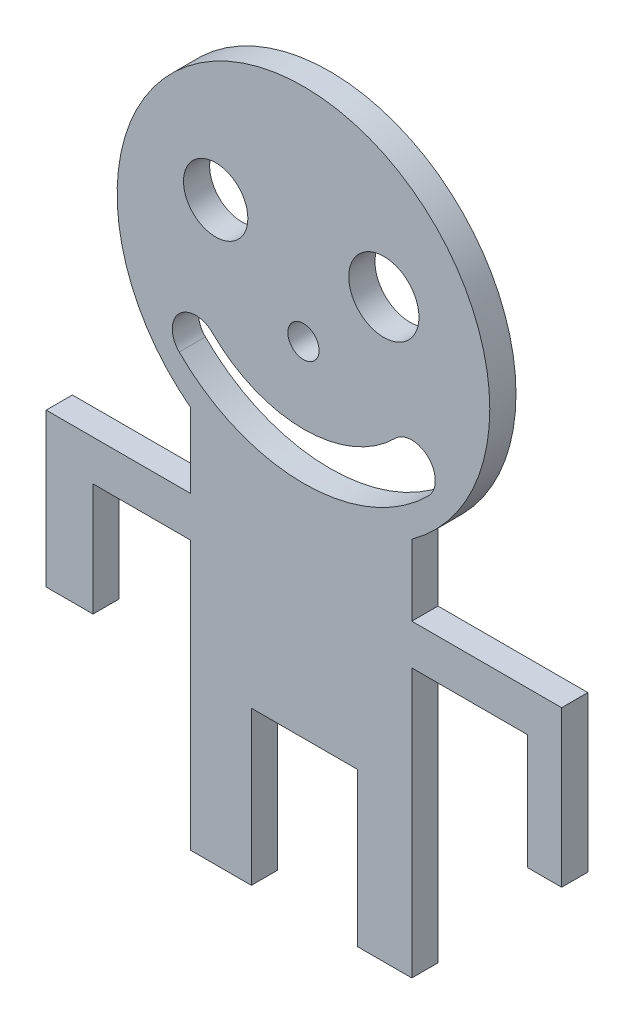
ISO-10303-21;
HEADER;
FILE_DESCRIPTION(('STEP AP214'),'2;1');
FILE_NAME('part.step','',(''),(''),'','','');
FILE_SCHEMA(('AUTOMOTIVE_DESIGN { 1 0 10303 214 1 1 1 1 }'));
ENDSEC;
DATA;
#1=APPLICATION_CONTEXT('core data for automotive mechanical design processes');
#2=APPLICATION_PROTOCOL_DEFINITION('international standard','automotive_design',2000,#1);
#3=PRODUCT_CONTEXT('',#1,'mechanical');
#4=PRODUCT('Part','Part','',(#3));
#5=PRODUCT_RELATED_PRODUCT_CATEGORY('part','',(#4));
#6=PRODUCT_DEFINITION_FORMATION('','',#4);
#7=PRODUCT_DEFINITION_CONTEXT('part definition',#1,'design');
#8=PRODUCT_DEFINITION('design','',#6,#7);
#9=PRODUCT_DEFINITION_SHAPE('','',#8);
#10=(LENGTH_UNIT() NAMED_UNIT(*) SI_UNIT(.MILLI.,.METRE.));
#11=(NAMED_UNIT(*) PLANE_ANGLE_UNIT() SI_UNIT($,.RADIAN.));
#12=(NAMED_UNIT(*) SI_UNIT($,.STERADIAN.) SOLID_ANGLE_UNIT());
#13=UNCERTAINTY_MEASURE_WITH_UNIT(LENGTH_MEASURE(1.E-05),#10,'distance_accuracy_value','');
#14=(GEOMETRIC_REPRESENTATION_CONTEXT(3) GLOBAL_UNCERTAINTY_ASSIGNED_CONTEXT((#13)) GLOBAL_UNIT_ASSIGNED_CONTEXT((#10,
#11,#12)) REPRESENTATION_CONTEXT('',''));
#15=CARTESIAN_POINT('',(0.,0.,0.));
#16=DIRECTION('',(0.,0.,1.));
#17=DIRECTION('',(1.,0.,0.));
#18=AXIS2_PLACEMENT_3D('',#15,#16,#17);
#19=CARTESIAN_POINT('',(0.,0.,10.));
#20=DIRECTION('',(0.,0.,1.));
#21=DIRECTION('',(1.,0.,0.));
#22=AXIS2_PLACEMENT_3D('',#19,#20,#21);
#23=PLANE('',#22);
#24=CARTESIAN_POINT('',(30.6884901447946,16.8513640326862,10.));
#25=DIRECTION('',(0.,0.,1.));
#26=DIRECTION('',(1.,0.,0.));
#27=AXIS2_PLACEMENT_3D('',#24,#25,#26);
#28=CIRCLE('',#27,13.4023424425975);
#29=CARTESIAN_POINT('',(44.0908325873921,16.8513640326862,10.));
#30=VERTEX_POINT('',#29);
#31=EDGE_CURVE('E257',#30,#30,#28,.T.);
#32=ORIENTED_EDGE('',*,*,#31,.F.);
#33=EDGE_LOOP('',(#32));
#34=FACE_BOUND('',#33,.T.);
#35=CARTESIAN_POINT('',(0.,0.,10.));
#36=DIRECTION('',(0.,0.,1.));
#37=DIRECTION('',(1.,0.,0.));
#38=AXIS2_PLACEMENT_3D('',#35,#36,#37);
#39=CIRCLE('',#38,71.1280028052425);
#40=CARTESIAN_POINT('',(41.3499882728577,-57.8737527113727,10.));
#41=VERTEX_POINT('',#40);
#42=CARTESIAN_POINT('',(-43.1667082599356,-56.5316555662771,10.));
#43=VERTEX_POINT('',#42);
#44=EDGE_CURVE('E273',#41,#43,#39,.T.);
#45=ORIENTED_EDGE('',*,*,#44,.T.);
#46=DIRECTION('',(0.,-1.,0.));
#47=VECTOR('',#46,1.);
#48=CARTESIAN_POINT('',(-43.1667082599356,-56.5316555662771,10.));
#49=LINE('',#48,#47);
#50=CARTESIAN_POINT('',(-43.1667082599356,-85.0113060817988,10.));
#51=VERTEX_POINT('',#50);
#52=EDGE_CURVE('E277',#43,#51,#49,.T.);
#53=ORIENTED_EDGE('',*,*,#52,.T.);
#54=DIRECTION('',(-1.,0.,0.));
#55=VECTOR('',#54,1.);
#56=CARTESIAN_POINT('',(-43.1667082599356,-85.0113060817988,10.));
#57=LINE('',#56,#55);
#58=CARTESIAN_POINT('',(-98.2179549040455,-85.0113060817988,10.));
#59=VERTEX_POINT('',#58);
#60=EDGE_CURVE('E281',#51,#59,#57,.T.);
#61=ORIENTED_EDGE('',*,*,#60,.T.);
#62=DIRECTION('',(0.,-1.,0.));
#63=VECTOR('',#62,1.);
#64=CARTESIAN_POINT('',(-98.2179549040455,-85.0113060817988,10.));
#65=LINE('',#64,#63);
#66=CARTESIAN_POINT('',(-98.2179549040455,-143.510977861407,10.));
#67=VERTEX_POINT('',#66);
#68=EDGE_CURVE('E284',#59,#67,#65,.T.);
#69=ORIENTED_EDGE('',*,*,#68,.T.);
#70=DIRECTION('',(1.,0.,0.));
#71=VECTOR('',#70,1.);
#72=CARTESIAN_POINT('',(-98.2179549040455,-143.510977861407,10.));
#73=LINE('',#72,#71);
#74=CARTESIAN_POINT('',(-80.3296255168925,-143.510977861407,10.));
#75=VERTEX_POINT('',#74);
#76=EDGE_CURVE('E287',#67,#75,#73,.T.);
#77=ORIENTED_EDGE('',*,*,#76,.T.);
#78=DIRECTION('',(0.,1.,0.));
#79=VECTOR('',#78,1.);
#80=CARTESIAN_POINT('',(-80.3296255168925,-100.459006623722,10.));
#81=LINE('',#80,#79);
#82=CARTESIAN_POINT('',(-80.3296255168925,-100.459006623722,10.));
#83=VERTEX_POINT('',#82);
#84=EDGE_CURVE('E290',#75,#83,#81,.T.);
#85=ORIENTED_EDGE('',*,*,#84,.T.);
#86=DIRECTION('',(1.,0.,0.));
#87=VECTOR('',#86,1.);
#88=CARTESIAN_POINT('',(-43.1667082599356,-100.459006623722,10.));
#89=LINE('',#88,#87);
#90=CARTESIAN_POINT('',(-43.1667082599356,-100.459006623722,10.));
#91=VERTEX_POINT('',#90);
#92=EDGE_CURVE('E293',#83,#91,#89,.T.);
#93=ORIENTED_EDGE('',*,*,#92,.T.);
#94=DIRECTION('',(0.,-1.,0.));
#95=VECTOR('',#94,1.);
#96=CARTESIAN_POINT('',(-43.1667082599356,-100.459006623722,10.));
#97=LINE('',#96,#95);
#98=CARTESIAN_POINT('',(-43.1667082599356,-202.977586364646,10.));
#99=VERTEX_POINT('',#98);
#100=EDGE_CURVE('E296',#91,#99,#97,.T.);
#101=ORIENTED_EDGE('',*,*,#100,.T.);
#102=DIRECTION('',(1.,0.,0.));
#103=VECTOR('',#102,1.);
#104=CARTESIAN_POINT('',(-43.1667082599356,-202.977586364646,10.));
#105=LINE('',#104,#103);
#106=CARTESIAN_POINT('',(-19.8960802900243,-202.977586364646,10.));
#107=VERTEX_POINT('',#106);
#108=EDGE_CURVE('E299',#99,#107,#105,.T.);
#109=ORIENTED_EDGE('',*,*,#108,.T.);
#110=DIRECTION('',(0.,1.,0.));
#111=VECTOR('',#110,1.);
#112=CARTESIAN_POINT('',(-19.8960802900243,-144.386357681167,10.));
#113=LINE('',#112,#111);
#114=CARTESIAN_POINT('',(-19.8960802900243,-144.386357681167,10.));
#115=VERTEX_POINT('',#114);
#116=EDGE_CURVE('E302',#107,#115,#113,.T.);
#117=ORIENTED_EDGE('',*,*,#116,.T.);
#118=DIRECTION('',(1.,0.,0.));
#119=VECTOR('',#118,1.);
#120=CARTESIAN_POINT('',(-19.8960802900243,-144.386357681167,10.));
#121=LINE('',#120,#119);
#122=CARTESIAN_POINT('',(20.7152621024311,-144.386357681167,10.));
#123=VERTEX_POINT('',#122);
#124=EDGE_CURVE('E305',#115,#123,#121,.T.);
#125=ORIENTED_EDGE('',*,*,#124,.T.);
#126=DIRECTION('',(0.,-1.,0.));
#127=VECTOR('',#126,1.);
#128=CARTESIAN_POINT('',(20.7152621024311,-144.386357681167,10.));
#129=LINE('',#128,#127);
#130=CARTESIAN_POINT('',(20.7152621024311,-202.977586364646,10.));
#131=VERTEX_POINT('',#130);
#132=EDGE_CURVE('E308',#123,#131,#129,.T.);
#133=ORIENTED_EDGE('',*,*,#132,.T.);
#134=DIRECTION('',(1.,0.,0.));
#135=VECTOR('',#134,1.);
#136=CARTESIAN_POINT('',(41.3499882728577,-202.977586364646,10.));
#137=LINE('',#136,#135);
#138=CARTESIAN_POINT('',(41.3499882728577,-202.977586364646,10.));
#139=VERTEX_POINT('',#138);
#140=EDGE_CURVE('E311',#131,#139,#137,.T.);
#141=ORIENTED_EDGE('',*,*,#140,.T.);
#142=DIRECTION('',(0.,1.,0.));
#143=VECTOR('',#142,1.);
#144=CARTESIAN_POINT('',(41.3499882728577,-144.386357681167,10.));
#145=LINE('',#144,#143);
#146=CARTESIAN_POINT('',(41.3499882728577,-100.459006623722,10.));
#147=VERTEX_POINT('',#146);
#148=EDGE_CURVE('E314',#139,#147,#145,.T.);
#149=ORIENTED_EDGE('',*,*,#148,.T.);
#150=DIRECTION('',(1.,0.,0.));
#151=VECTOR('',#150,1.);
#152=CARTESIAN_POINT('',(41.3499882728577,-100.459006623722,10.));
#153=LINE('',#152,#151);
#154=CARTESIAN_POINT('',(85.5000225856338,-100.459006623722,10.));
#155=VERTEX_POINT('',#154);
#156=EDGE_CURVE('E317',#147,#155,#153,.T.);
#157=ORIENTED_EDGE('',*,*,#156,.T.);
#158=DIRECTION('',(0.,-1.,0.));
#159=VECTOR('',#158,1.);
#160=CARTESIAN_POINT('',(85.5000225856338,-100.459006623722,10.));
#161=LINE('',#160,#159);
#162=CARTESIAN_POINT('',(85.5000225856338,-144.386357681167,10.));
#163=VERTEX_POINT('',#162);
#164=EDGE_CURVE('E320',#155,#163,#161,.T.);
#165=ORIENTED_EDGE('',*,*,#164,.T.);
#166=DIRECTION('',(1.,0.,0.));
#167=VECTOR('',#166,1.);
#168=CARTESIAN_POINT('',(98.5536683546373,-144.386357681167,10.));
#169=LINE('',#168,#167);
#170=CARTESIAN_POINT('',(98.5536683546373,-144.386357681167,10.));
#171=VERTEX_POINT('',#170);
#172=EDGE_CURVE('E323',#163,#171,#169,.T.);
#173=ORIENTED_EDGE('',*,*,#172,.T.);
#174=DIRECTION('',(0.,1.,0.));
#175=VECTOR('',#174,1.);
#176=CARTESIAN_POINT('',(98.5536683546373,-100.459006623722,10.));
#177=LINE('',#176,#175);
#178=CARTESIAN_POINT('',(98.5536683546373,-85.0113060817988,10.));
#179=VERTEX_POINT('',#178);
#180=EDGE_CURVE('E326',#171,#179,#177,.T.);
#181=ORIENTED_EDGE('',*,*,#180,.T.);
#182=DIRECTION('',(-1.,0.,0.));
#183=VECTOR('',#182,1.);
#184=CARTESIAN_POINT('',(41.3499882728577,-85.0113060817988,10.));
#185=LINE('',#184,#183);
#186=CARTESIAN_POINT('',(41.3499882728577,-85.0113060817988,10.));
#187=VERTEX_POINT('',#186);
#188=EDGE_CURVE('E329',#179,#187,#185,.T.);
#189=ORIENTED_EDGE('',*,*,#188,.T.);
#190=DIRECTION('',(0.,1.,0.));
#191=VECTOR('',#190,1.);
#192=CARTESIAN_POINT('',(41.3499882728577,-57.8737527113727,10.));
#193=LINE('',#192,#191);
#194=EDGE_CURVE('E332',#187,#41,#193,.T.);
#195=ORIENTED_EDGE('',*,*,#194,.T.);
#196=EDGE_LOOP('',(#45,#53,#61,#69,#77,#85,#93,#101,#109,#117,#125,#133,#141,#149,#157,#165,
#173,#181,#189,#195));
#197=FACE_BOUND('',#196,.T.);
#198=CARTESIAN_POINT('',(-33.5174208042074,16.8513640326862,10.));
#199=DIRECTION('',(0.,0.,1.));
#200=DIRECTION('',(1.,0.,0.));
#201=AXIS2_PLACEMENT_3D('',#198,#199,#200);
#202=CIRCLE('',#201,12.2880186326441);
#203=CARTESIAN_POINT('',(-21.2294021715633,16.8513640326862,10.));
#204=VERTEX_POINT('',#203);
#205=EDGE_CURVE('E265',#204,#204,#202,.T.);
#206=ORIENTED_EDGE('',*,*,#205,.F.);
#207=EDGE_LOOP('',(#206));
#208=FACE_BOUND('',#207,.T.);
#209=CARTESIAN_POINT('',(0.,-13.2377529065141,10.));
#210=DIRECTION('',(0.,0.,1.));
#211=DIRECTION('',(1.,0.,0.));
#212=AXIS2_PLACEMENT_3D('',#209,#210,#211);
#213=CIRCLE('',#212,5.96665513408762);
#214=CARTESIAN_POINT('',(5.96665513408762,-13.2377529065141,10.));
#215=VERTEX_POINT('',#214);
#216=EDGE_CURVE('E249',#215,#215,#213,.T.);
#217=ORIENTED_EDGE('',*,*,#216,.F.);
#218=EDGE_LOOP('',(#217));
#219=FACE_BOUND('',#218,.T.);
#220=CARTESIAN_POINT('',(0.12552884434712,7.13755462711763,10.));
#221=DIRECTION('',(0.,0.,1.));
#222=DIRECTION('',(1.,0.,0.));
#223=AXIS2_PLACEMENT_3D('',#220,#221,#222);
#224=CIRCLE('',#223,67.2712986349469);
#225=CARTESIAN_POINT('',(-47.4424625996492,-40.4304368168787,10.));
#226=VERTEX_POINT('',#225);
#227=CARTESIAN_POINT('',(47.6935202883434,-40.4304368168787,10.));
#228=VERTEX_POINT('',#227);
#229=EDGE_CURVE('E210',#226,#228,#224,.T.);
#230=ORIENTED_EDGE('',*,*,#229,.F.);
#231=CARTESIAN_POINT('',(-41.0989305841634,-34.0869048013929,10.));
#232=DIRECTION('',(0.,0.,1.));
#233=DIRECTION('',(1.,0.,0.));
#234=AXIS2_PLACEMENT_3D('',#231,#232,#233);
#235=CIRCLE('',#234,8.97110900964793);
#236=CARTESIAN_POINT('',(-34.7553985686777,-27.7433727859071,10.));
#237=VERTEX_POINT('',#236);
#238=EDGE_CURVE('E201',#237,#226,#235,.T.);
#239=ORIENTED_EDGE('',*,*,#238,.F.);
#240=CARTESIAN_POINT('',(0.12552884434712,7.13755462711763,10.));
#241=DIRECTION('',(0.,0.,-1.));
#242=DIRECTION('',(1.,0.,0.));
#243=AXIS2_PLACEMENT_3D('',#240,#241,#242);
#244=CIRCLE('',#243,49.3290806156511);
#245=CARTESIAN_POINT('',(35.0064562573719,-27.7433727859071,10.));
#246=VERTEX_POINT('',#245);
#247=EDGE_CURVE('E227',#246,#237,#244,.T.);
#248=ORIENTED_EDGE('',*,*,#247,.F.);
#249=CARTESIAN_POINT('',(41.3499882728577,-34.0869048013929,10.));
#250=DIRECTION('',(0.,0.,1.));
#251=DIRECTION('',(1.,0.,0.));
#252=AXIS2_PLACEMENT_3D('',#249,#250,#251);
#253=CIRCLE('',#252,8.97110900964793);
#254=EDGE_CURVE('E223',#228,#246,#253,.T.);
#255=ORIENTED_EDGE('',*,*,#254,.F.);
#256=EDGE_LOOP('',(#230,#239,#248,#255));
#257=FACE_BOUND('',#256,.T.);
#258=ADVANCED_FACE('F39',(#34,#197,#208,#219,#257),#23,.T.);
#259=CARTESIAN_POINT('',(0.,0.,0.));
#260=DIRECTION('',(0.,0.,1.));
#261=DIRECTION('',(1.,0.,0.));
#262=AXIS2_PLACEMENT_3D('',#259,#260,#261);
#263=PLANE('',#262);
#264=CARTESIAN_POINT('',(0.,-13.2377529065141,0.));
#265=DIRECTION('',(0.,0.,1.));
#266=DIRECTION('',(1.,0.,0.));
#267=AXIS2_PLACEMENT_3D('',#264,#265,#266);
#268=CIRCLE('',#267,5.96665513408762);
#269=CARTESIAN_POINT('',(5.96665513408762,-13.2377529065141,0.));
#270=VERTEX_POINT('',#269);
#271=EDGE_CURVE('E219',#270,#270,#268,.T.);
#272=ORIENTED_EDGE('',*,*,#271,.T.);
#273=EDGE_LOOP('',(#272));
#274=FACE_BOUND('',#273,.T.);
#275=CARTESIAN_POINT('',(30.6884901447946,16.8513640326862,0.));
#276=DIRECTION('',(0.,0.,1.));
#277=DIRECTION('',(1.,0.,0.));
#278=AXIS2_PLACEMENT_3D('',#275,#276,#277);
#279=CIRCLE('',#278,13.4023424425975);
#280=CARTESIAN_POINT('',(44.0908325873921,16.8513640326862,0.));
#281=VERTEX_POINT('',#280);
#282=EDGE_CURVE('E253',#281,#281,#279,.T.);
#283=ORIENTED_EDGE('',*,*,#282,.T.);
#284=EDGE_LOOP('',(#283));
#285=FACE_BOUND('',#284,.T.);
#286=CARTESIAN_POINT('',(-33.5174208042074,16.8513640326862,0.));
#287=DIRECTION('',(0.,0.,1.));
#288=DIRECTION('',(1.,0.,0.));
#289=AXIS2_PLACEMENT_3D('',#286,#287,#288);
#290=CIRCLE('',#289,12.2880186326441);
#291=CARTESIAN_POINT('',(-21.2294021715633,16.8513640326862,0.));
#292=VERTEX_POINT('',#291);
#293=EDGE_CURVE('E261',#292,#292,#290,.T.);
#294=ORIENTED_EDGE('',*,*,#293,.T.);
#295=EDGE_LOOP('',(#294));
#296=FACE_BOUND('',#295,.T.);
#297=CARTESIAN_POINT('',(0.,0.,0.));
#298=DIRECTION('',(0.,0.,1.));
#299=DIRECTION('',(1.,0.,0.));
#300=AXIS2_PLACEMENT_3D('',#297,#298,#299);
#301=CIRCLE('',#300,71.1280028052425);
#302=CARTESIAN_POINT('',(41.3499882728577,-57.8737527113727,0.));
#303=VERTEX_POINT('',#302);
#304=CARTESIAN_POINT('',(-43.1667082599356,-56.5316555662771,0.));
#305=VERTEX_POINT('',#304);
#306=EDGE_CURVE('E269',#303,#305,#301,.T.);
#307=ORIENTED_EDGE('',*,*,#306,.F.);
#308=DIRECTION('',(0.,1.,0.));
#309=VECTOR('',#308,1.);
#310=CARTESIAN_POINT('',(41.3499882728577,-57.8737527113727,0.));
#311=LINE('',#310,#309);
#312=CARTESIAN_POINT('',(41.3499882728577,-85.0113060817988,0.));
#313=VERTEX_POINT('',#312);
#314=EDGE_CURVE('E278',#313,#303,#311,.T.);
#315=ORIENTED_EDGE('',*,*,#314,.F.);
#316=DIRECTION('',(-1.,0.,0.));
#317=VECTOR('',#316,1.);
#318=CARTESIAN_POINT('',(41.3499882728577,-85.0113060817988,0.));
#319=LINE('',#318,#317);
#320=CARTESIAN_POINT('',(98.5536683546373,-85.0113060817988,0.));
#321=VERTEX_POINT('',#320);
#322=EDGE_CURVE('E394',#321,#313,#319,.T.);
#323=ORIENTED_EDGE('',*,*,#322,.F.);
#324=DIRECTION('',(0.,1.,0.));
#325=VECTOR('',#324,1.);
#326=CARTESIAN_POINT('',(98.5536683546373,-85.0113060817988,0.));
#327=LINE('',#326,#325);
#328=CARTESIAN_POINT('',(98.5536683546373,-144.386357681167,0.));
#329=VERTEX_POINT('',#328);
#330=EDGE_CURVE('E391',#329,#321,#327,.T.);
#331=ORIENTED_EDGE('',*,*,#330,.F.);
#332=DIRECTION('',(1.,0.,0.));
#333=VECTOR('',#332,1.);
#334=CARTESIAN_POINT('',(98.5536683546373,-144.386357681167,0.));
#335=LINE('',#334,#333);
#336=CARTESIAN_POINT('',(85.5000225856338,-144.386357681167,0.));
#337=VERTEX_POINT('',#336);
#338=EDGE_CURVE('E387',#337,#329,#335,.T.);
#339=ORIENTED_EDGE('',*,*,#338,.F.);
#340=DIRECTION('',(0.,-1.,0.));
#341=VECTOR('',#340,1.);
#342=CARTESIAN_POINT('',(85.5000225856338,-100.459006623722,0.));
#343=LINE('',#342,#341);
#344=CARTESIAN_POINT('',(85.5000225856338,-100.459006623722,0.));
#345=VERTEX_POINT('',#344);
#346=EDGE_CURVE('E384',#345,#337,#343,.T.);
#347=ORIENTED_EDGE('',*,*,#346,.F.);
#348=DIRECTION('',(1.,0.,0.));
#349=VECTOR('',#348,1.);
#350=CARTESIAN_POINT('',(41.3499882728577,-100.459006623722,0.));
#351=LINE('',#350,#349);
#352=CARTESIAN_POINT('',(41.3499882728577,-100.459006623722,0.));
#353=VERTEX_POINT('',#352);
#354=EDGE_CURVE('E381',#353,#345,#351,.T.);
#355=ORIENTED_EDGE('',*,*,#354,.F.);
#356=DIRECTION('',(0.,1.,0.));
#357=VECTOR('',#356,1.);
#358=CARTESIAN_POINT('',(41.3499882728577,-100.459006623722,0.));
#359=LINE('',#358,#357);
#360=CARTESIAN_POINT('',(41.3499882728577,-202.977586364646,0.));
#361=VERTEX_POINT('',#360);
#362=EDGE_CURVE('E378',#361,#353,#359,.T.);
#363=ORIENTED_EDGE('',*,*,#362,.F.);
#364=DIRECTION('',(1.,0.,0.));
#365=VECTOR('',#364,1.);
#366=CARTESIAN_POINT('',(41.3499882728577,-202.977586364646,0.));
#367=LINE('',#366,#365);
#368=CARTESIAN_POINT('',(20.7152621024311,-202.977586364646,0.));
#369=VERTEX_POINT('',#368);
#370=EDGE_CURVE('E374',#369,#361,#367,.T.);
#371=ORIENTED_EDGE('',*,*,#370,.F.);
#372=DIRECTION('',(0.,-1.,0.));
#373=VECTOR('',#372,1.);
#374=CARTESIAN_POINT('',(20.7152621024311,-144.386357681167,0.));
#375=LINE('',#374,#373);
#376=CARTESIAN_POINT('',(20.7152621024311,-144.386357681167,0.));
#377=VERTEX_POINT('',#376);
#378=EDGE_CURVE('E371',#377,#369,#375,.T.);
#379=ORIENTED_EDGE('',*,*,#378,.F.);
#380=DIRECTION('',(1.,0.,0.));
#381=VECTOR('',#380,1.);
#382=CARTESIAN_POINT('',(-19.8960802900243,-144.386357681167,0.));
#383=LINE('',#382,#381);
#384=CARTESIAN_POINT('',(-19.8960802900243,-144.386357681167,0.));
#385=VERTEX_POINT('',#384);
#386=EDGE_CURVE('E368',#385,#377,#383,.T.);
#387=ORIENTED_EDGE('',*,*,#386,.F.);
#388=DIRECTION('',(0.,1.,0.));
#389=VECTOR('',#388,1.);
#390=CARTESIAN_POINT('',(-19.8960802900243,-144.386357681167,0.));
#391=LINE('',#390,#389);
#392=CARTESIAN_POINT('',(-19.8960802900243,-202.977586364646,0.));
#393=VERTEX_POINT('',#392);
#394=EDGE_CURVE('E365',#393,#385,#391,.T.);
#395=ORIENTED_EDGE('',*,*,#394,.F.);
#396=DIRECTION('',(1.,0.,0.));
#397=VECTOR('',#396,1.);
#398=CARTESIAN_POINT('',(-43.1667082599356,-202.977586364646,0.));
#399=LINE('',#398,#397);
#400=CARTESIAN_POINT('',(-43.1667082599356,-202.977586364646,0.));
#401=VERTEX_POINT('',#400);
#402=EDGE_CURVE('E362',#401,#393,#399,.T.);
#403=ORIENTED_EDGE('',*,*,#402,.F.);
#404=DIRECTION('',(0.,-1.,0.));
#405=VECTOR('',#404,1.);
#406=CARTESIAN_POINT('',(-43.1667082599356,-144.386357681167,0.));
#407=LINE('',#406,#405);
#408=CARTESIAN_POINT('',(-43.1667082599356,-100.459006623722,0.));
#409=VERTEX_POINT('',#408);
#410=EDGE_CURVE('E359',#409,#401,#407,.T.);
#411=ORIENTED_EDGE('',*,*,#410,.F.);
#412=DIRECTION('',(1.,0.,0.));
#413=VECTOR('',#412,1.);
#414=CARTESIAN_POINT('',(-43.1667082599356,-100.459006623722,0.));
#415=LINE('',#414,#413);
#416=CARTESIAN_POINT('',(-80.3296255168925,-100.459006623722,0.));
#417=VERTEX_POINT('',#416);
#418=EDGE_CURVE('E355',#417,#409,#415,.T.);
#419=ORIENTED_EDGE('',*,*,#418,.F.);
#420=DIRECTION('',(0.,1.,0.));
#421=VECTOR('',#420,1.);
#422=CARTESIAN_POINT('',(-80.3296255168925,-100.459006623722,0.));
#423=LINE('',#422,#421);
#424=CARTESIAN_POINT('',(-80.3296255168925,-143.510977861407,0.));
#425=VERTEX_POINT('',#424);
#426=EDGE_CURVE('E352',#425,#417,#423,.T.);
#427=ORIENTED_EDGE('',*,*,#426,.F.);
#428=DIRECTION('',(1.,0.,0.));
#429=VECTOR('',#428,1.);
#430=CARTESIAN_POINT('',(-98.2179549040455,-143.510977861407,0.));
#431=LINE('',#430,#429);
#432=CARTESIAN_POINT('',(-98.2179549040455,-143.510977861407,0.));
#433=VERTEX_POINT('',#432);
#434=EDGE_CURVE('E349',#433,#425,#431,.T.);
#435=ORIENTED_EDGE('',*,*,#434,.F.);
#436=DIRECTION('',(0.,-1.,0.));
#437=VECTOR('',#436,1.);
#438=CARTESIAN_POINT('',(-98.2179549040455,-100.459006623722,0.));
#439=LINE('',#438,#437);
#440=CARTESIAN_POINT('',(-98.2179549040455,-85.0113060817988,0.));
#441=VERTEX_POINT('',#440);
#442=EDGE_CURVE('E346',#441,#433,#439,.T.);
#443=ORIENTED_EDGE('',*,*,#442,.F.);
#444=DIRECTION('',(-1.,0.,0.));
#445=VECTOR('',#444,1.);
#446=CARTESIAN_POINT('',(-43.1667082599356,-85.0113060817988,0.));
#447=LINE('',#446,#445);
#448=CARTESIAN_POINT('',(-43.1667082599356,-85.0113060817988,0.));
#449=VERTEX_POINT('',#448);
#450=EDGE_CURVE('E342',#449,#441,#447,.T.);
#451=ORIENTED_EDGE('',*,*,#450,.F.);
#452=DIRECTION('',(0.,-1.,0.));
#453=VECTOR('',#452,1.);
#454=CARTESIAN_POINT('',(-43.1667082599356,-56.5316555662771,0.));
#455=LINE('',#454,#453);
#456=EDGE_CURVE('E339',#305,#449,#455,.T.);
#457=ORIENTED_EDGE('',*,*,#456,.F.);
#458=EDGE_LOOP('',(#307,#315,#323,#331,#339,#347,#355,#363,#371,#379,#387,#395,#403,#411,#419,
#427,#435,#443,#451,#457));
#459=FACE_BOUND('',#458,.T.);
#460=CARTESIAN_POINT('',(-41.0989305841634,-34.0869048013929,0.));
#461=DIRECTION('',(0.,0.,1.));
#462=DIRECTION('',(1.,0.,0.));
#463=AXIS2_PLACEMENT_3D('',#460,#461,#462);
#464=CIRCLE('',#463,8.97110900964793);
#465=CARTESIAN_POINT('',(-34.7553985686776,-27.7433727859071,0.));
#466=VERTEX_POINT('',#465);
#467=CARTESIAN_POINT('',(-47.4424625996492,-40.4304368168787,0.));
#468=VERTEX_POINT('',#467);
#469=EDGE_CURVE('E63',#466,#468,#464,.T.);
#470=ORIENTED_EDGE('',*,*,#469,.T.);
#471=CARTESIAN_POINT('',(0.12552884434712,7.13755462711763,0.));
#472=DIRECTION('',(0.,0.,1.));
#473=DIRECTION('',(1.,0.,0.));
#474=AXIS2_PLACEMENT_3D('',#471,#472,#473);
#475=CIRCLE('',#474,67.2712986349469);
#476=CARTESIAN_POINT('',(47.6935202883434,-40.4304368168787,0.));
#477=VERTEX_POINT('',#476);
#478=EDGE_CURVE('E217',#468,#477,#475,.T.);
#479=ORIENTED_EDGE('',*,*,#478,.T.);
#480=CARTESIAN_POINT('',(41.3499882728577,-34.0869048013929,0.));
#481=DIRECTION('',(0.,0.,1.));
#482=DIRECTION('',(1.,0.,0.));
#483=AXIS2_PLACEMENT_3D('',#480,#481,#482);
#484=CIRCLE('',#483,8.97110900964793);
#485=CARTESIAN_POINT('',(35.0064562573719,-27.7433727859071,0.));
#486=VERTEX_POINT('',#485);
#487=EDGE_CURVE('E236',#477,#486,#484,.T.);
#488=ORIENTED_EDGE('',*,*,#487,.T.);
#489=CARTESIAN_POINT('',(0.12552884434712,7.13755462711763,0.));
#490=DIRECTION('',(0.,0.,-1.));
#491=DIRECTION('',(1.,0.,0.));
#492=AXIS2_PLACEMENT_3D('',#489,#490,#491);
#493=CIRCLE('',#492,49.3290806156511);
#494=EDGE_CURVE('E211',#486,#466,#493,.T.);
#495=ORIENTED_EDGE('',*,*,#494,.T.);
#496=EDGE_LOOP('',(#470,#479,#488,#495));
#497=FACE_BOUND('',#496,.T.);
#498=ADVANCED_FACE('F480',(#274,#285,#296,#459,#497),#263,.F.);
#499=CARTESIAN_POINT('',(0.,0.,10.));
#500=DIRECTION('',(0.,0.,-1.));
#501=DIRECTION('',(-1.,0.,0.));
#502=AXIS2_PLACEMENT_3D('',#499,#500,#501);
#503=CYLINDRICAL_SURFACE('',#502,71.1280028052425);
#504=ORIENTED_EDGE('',*,*,#306,.T.);
#505=DIRECTION('',(0.,0.,-1.));
#506=VECTOR('',#505,1.);
#507=CARTESIAN_POINT('',(-43.1667082599356,-56.5316555662771,10.));
#508=LINE('',#507,#506);
#509=EDGE_CURVE('E11',#43,#305,#508,.T.);
#510=ORIENTED_EDGE('',*,*,#509,.F.);
#511=ORIENTED_EDGE('',*,*,#44,.F.);
#512=DIRECTION('',(0.,0.,-1.));
#513=VECTOR('',#512,1.);
#514=CARTESIAN_POINT('',(41.3499882728577,-57.8737527113727,10.));
#515=LINE('',#514,#513);
#516=EDGE_CURVE('E335',#41,#303,#515,.T.);
#517=ORIENTED_EDGE('',*,*,#516,.T.);
#518=EDGE_LOOP('',(#504,#510,#511,#517));
#519=FACE_BOUND('',#518,.T.);
#520=ADVANCED_FACE('F41',(#519),#503,.T.);
#521=CARTESIAN_POINT('',(-43.1667082599356,-56.5316555662771,10.));
#522=DIRECTION('',(1.,0.,0.));
#523=DIRECTION('',(0.,0.,-1.));
#524=AXIS2_PLACEMENT_3D('',#521,#522,#523);
#525=PLANE('',#524);
#526=ORIENTED_EDGE('',*,*,#456,.T.);
#527=DIRECTION('',(0.,0.,-1.));
#528=VECTOR('',#527,1.);
#529=CARTESIAN_POINT('',(-43.1667082599356,-85.0113060817988,10.));
#530=LINE('',#529,#528);
#531=EDGE_CURVE('E48',#51,#449,#530,.T.);
#532=ORIENTED_EDGE('',*,*,#531,.F.);
#533=ORIENTED_EDGE('',*,*,#52,.F.);
#534=ORIENTED_EDGE('',*,*,#509,.T.);
#535=EDGE_LOOP('',(#526,#532,#533,#534));
#536=FACE_BOUND('',#535,.T.);
#537=ADVANCED_FACE('F498',(#536),#525,.F.);
#538=CARTESIAN_POINT('',(-43.1667082599356,-85.0113060817988,10.));
#539=DIRECTION('',(0.,-1.,0.));
#540=DIRECTION('',(0.,0.,-1.));
#541=AXIS2_PLACEMENT_3D('',#538,#539,#540);
#542=PLANE('',#541);
#543=ORIENTED_EDGE('',*,*,#450,.T.);
#544=DIRECTION('',(0.,0.,-1.));
#545=VECTOR('',#544,1.);
#546=CARTESIAN_POINT('',(-98.2179549040455,-85.0113060817988,10.));
#547=LINE('',#546,#545);
#548=EDGE_CURVE('E466',#59,#441,#547,.T.);
#549=ORIENTED_EDGE('',*,*,#548,.F.);
#550=ORIENTED_EDGE('',*,*,#60,.F.);
#551=ORIENTED_EDGE('',*,*,#531,.T.);
#552=EDGE_LOOP('',(#543,#549,#550,#551));
#553=FACE_BOUND('',#552,.T.);
#554=ADVANCED_FACE('F475',(#553),#542,.F.);
#555=CARTESIAN_POINT('',(-98.2179549040455,-100.459006623722,10.));
#556=DIRECTION('',(1.,0.,0.));
#557=DIRECTION('',(0.,0.,-1.));
#558=AXIS2_PLACEMENT_3D('',#555,#556,#557);
#559=PLANE('',#558);
#560=ORIENTED_EDGE('',*,*,#442,.T.);
#561=DIRECTION('',(0.,0.,-1.));
#562=VECTOR('',#561,1.);
#563=CARTESIAN_POINT('',(-98.2179549040455,-143.510977861407,10.));
#564=LINE('',#563,#562);
#565=EDGE_CURVE('E462',#67,#433,#564,.T.);
#566=ORIENTED_EDGE('',*,*,#565,.F.);
#567=ORIENTED_EDGE('',*,*,#68,.F.);
#568=ORIENTED_EDGE('',*,*,#548,.T.);
#569=EDGE_LOOP('',(#560,#566,#567,#568));
#570=FACE_BOUND('',#569,.T.);
#571=ADVANCED_FACE('F486',(#570),#559,.F.);
#572=CARTESIAN_POINT('',(-98.2179549040455,-143.510977861407,10.));
#573=DIRECTION('',(0.,1.,0.));
#574=DIRECTION('',(0.,0.,1.));
#575=AXIS2_PLACEMENT_3D('',#572,#573,#574);
#576=PLANE('',#575);
#577=ORIENTED_EDGE('',*,*,#434,.T.);
#578=DIRECTION('',(0.,0.,-1.));
#579=VECTOR('',#578,1.);
#580=CARTESIAN_POINT('',(-80.3296255168925,-143.510977861407,10.));
#581=LINE('',#580,#579);
#582=EDGE_CURVE('E458',#75,#425,#581,.T.);
#583=ORIENTED_EDGE('',*,*,#582,.F.);
#584=ORIENTED_EDGE('',*,*,#76,.F.);
#585=ORIENTED_EDGE('',*,*,#565,.T.);
#586=EDGE_LOOP('',(#577,#583,#584,#585));
#587=FACE_BOUND('',#586,.T.);
#588=ADVANCED_FACE('F490',(#587),#576,.F.);
#589=CARTESIAN_POINT('',(-80.3296255168925,-100.459006623722,10.));
#590=DIRECTION('',(-1.,0.,0.));
#591=DIRECTION('',(0.,0.,1.));
#592=AXIS2_PLACEMENT_3D('',#589,#590,#591);
#593=PLANE('',#592);
#594=ORIENTED_EDGE('',*,*,#426,.T.);
#595=DIRECTION('',(0.,0.,-1.));
#596=VECTOR('',#595,1.);
#597=CARTESIAN_POINT('',(-80.3296255168925,-100.459006623722,10.));
#598=LINE('',#597,#596);
#599=EDGE_CURVE('E454',#83,#417,#598,.T.);
#600=ORIENTED_EDGE('',*,*,#599,.F.);
#601=ORIENTED_EDGE('',*,*,#84,.F.);
#602=ORIENTED_EDGE('',*,*,#582,.T.);
#603=EDGE_LOOP('',(#594,#600,#601,#602));
#604=FACE_BOUND('',#603,.T.);
#605=ADVANCED_FACE('F568',(#604),#593,.F.);
#606=CARTESIAN_POINT('',(-43.1667082599356,-100.459006623722,10.));
#607=DIRECTION('',(0.,1.,0.));
#608=DIRECTION('',(0.,0.,1.));
#609=AXIS2_PLACEMENT_3D('',#606,#607,#608);
#610=PLANE('',#609);
#611=ORIENTED_EDGE('',*,*,#418,.T.);
#612=DIRECTION('',(0.,0.,-1.));
#613=VECTOR('',#612,1.);
#614=CARTESIAN_POINT('',(-43.1667082599356,-100.459006623722,10.));
#615=LINE('',#614,#613);
#616=EDGE_CURVE('E450',#91,#409,#615,.T.);
#617=ORIENTED_EDGE('',*,*,#616,.F.);
#618=ORIENTED_EDGE('',*,*,#92,.F.);
#619=ORIENTED_EDGE('',*,*,#599,.T.);
#620=EDGE_LOOP('',(#611,#617,#618,#619));
#621=FACE_BOUND('',#620,.T.);
#622=ADVANCED_FACE('F566',(#621),#610,.F.);
#623=CARTESIAN_POINT('',(-43.1667082599356,-144.386357681167,10.));
#624=DIRECTION('',(1.,0.,0.));
#625=DIRECTION('',(0.,0.,-1.));
#626=AXIS2_PLACEMENT_3D('',#623,#624,#625);
#627=PLANE('',#626);
#628=ORIENTED_EDGE('',*,*,#410,.T.);
#629=DIRECTION('',(0.,0.,-1.));
#630=VECTOR('',#629,1.);
#631=CARTESIAN_POINT('',(-43.1667082599356,-202.977586364646,10.));
#632=LINE('',#631,#630);
#633=EDGE_CURVE('E446',#99,#401,#632,.T.);
#634=ORIENTED_EDGE('',*,*,#633,.F.);
#635=ORIENTED_EDGE('',*,*,#100,.F.);
#636=ORIENTED_EDGE('',*,*,#616,.T.);
#637=EDGE_LOOP('',(#628,#634,#635,#636));
#638=FACE_BOUND('',#637,.T.);
#639=ADVANCED_FACE('F562',(#638),#627,.F.);
#640=CARTESIAN_POINT('',(-43.1667082599356,-202.977586364646,10.));
#641=DIRECTION('',(0.,1.,0.));
#642=DIRECTION('',(0.,0.,1.));
#643=AXIS2_PLACEMENT_3D('',#640,#641,#642);
#644=PLANE('',#643);
#645=ORIENTED_EDGE('',*,*,#402,.T.);
#646=DIRECTION('',(0.,0.,-1.));
#647=VECTOR('',#646,1.);
#648=CARTESIAN_POINT('',(-19.8960802900243,-202.977586364646,10.));
#649=LINE('',#648,#647);
#650=EDGE_CURVE('E442',#107,#393,#649,.T.);
#651=ORIENTED_EDGE('',*,*,#650,.F.);
#652=ORIENTED_EDGE('',*,*,#108,.F.);
#653=ORIENTED_EDGE('',*,*,#633,.T.);
#654=EDGE_LOOP('',(#645,#651,#652,#653));
#655=FACE_BOUND('',#654,.T.);
#656=ADVANCED_FACE('F557',(#655),#644,.F.);
#657=CARTESIAN_POINT('',(-19.8960802900243,-144.386357681167,10.));
#658=DIRECTION('',(-1.,0.,0.));
#659=DIRECTION('',(0.,0.,1.));
#660=AXIS2_PLACEMENT_3D('',#657,#658,#659);
#661=PLANE('',#660);
#662=ORIENTED_EDGE('',*,*,#394,.T.);
#663=DIRECTION('',(0.,0.,-1.));
#664=VECTOR('',#663,1.);
#665=CARTESIAN_POINT('',(-19.8960802900243,-144.386357681167,10.));
#666=LINE('',#665,#664);
#667=EDGE_CURVE('E438',#115,#385,#666,.T.);
#668=ORIENTED_EDGE('',*,*,#667,.F.);
#669=ORIENTED_EDGE('',*,*,#116,.F.);
#670=ORIENTED_EDGE('',*,*,#650,.T.);
#671=EDGE_LOOP('',(#662,#668,#669,#670));
#672=FACE_BOUND('',#671,.T.);
#673=ADVANCED_FACE('F552',(#672),#661,.F.);
#674=CARTESIAN_POINT('',(-19.8960802900243,-144.386357681167,10.));
#675=DIRECTION('',(0.,1.,0.));
#676=DIRECTION('',(0.,0.,1.));
#677=AXIS2_PLACEMENT_3D('',#674,#675,#676);
#678=PLANE('',#677);
#679=ORIENTED_EDGE('',*,*,#386,.T.);
#680=DIRECTION('',(0.,0.,-1.));
#681=VECTOR('',#680,1.);
#682=CARTESIAN_POINT('',(20.7152621024311,-144.386357681167,10.));
#683=LINE('',#682,#681);
#684=EDGE_CURVE('E434',#123,#377,#683,.T.);
#685=ORIENTED_EDGE('',*,*,#684,.F.);
#686=ORIENTED_EDGE('',*,*,#124,.F.);
#687=ORIENTED_EDGE('',*,*,#667,.T.);
#688=EDGE_LOOP('',(#679,#685,#686,#687));
#689=FACE_BOUND('',#688,.T.);
#690=ADVANCED_FACE('F548',(#689),#678,.F.);
#691=CARTESIAN_POINT('',(20.7152621024311,-144.386357681167,10.));
#692=DIRECTION('',(1.,0.,0.));
#693=DIRECTION('',(0.,0.,-1.));
#694=AXIS2_PLACEMENT_3D('',#691,#692,#693);
#695=PLANE('',#694);
#696=ORIENTED_EDGE('',*,*,#378,.T.);
#697=DIRECTION('',(0.,0.,-1.));
#698=VECTOR('',#697,1.);
#699=CARTESIAN_POINT('',(20.7152621024311,-202.977586364646,10.));
#700=LINE('',#699,#698);
#701=EDGE_CURVE('E430',#131,#369,#700,.T.);
#702=ORIENTED_EDGE('',*,*,#701,.F.);
#703=ORIENTED_EDGE('',*,*,#132,.F.);
#704=ORIENTED_EDGE('',*,*,#684,.T.);
#705=EDGE_LOOP('',(#696,#702,#703,#704));
#706=FACE_BOUND('',#705,.T.);
#707=ADVANCED_FACE('F543',(#706),#695,.F.);
#708=CARTESIAN_POINT('',(41.3499882728577,-202.977586364646,10.));
#709=DIRECTION('',(0.,1.,0.));
#710=DIRECTION('',(0.,0.,1.));
#711=AXIS2_PLACEMENT_3D('',#708,#709,#710);
#712=PLANE('',#711);
#713=ORIENTED_EDGE('',*,*,#370,.T.);
#714=DIRECTION('',(0.,0.,-1.));
#715=VECTOR('',#714,1.);
#716=CARTESIAN_POINT('',(41.3499882728577,-202.977586364646,10.));
#717=LINE('',#716,#715);
#718=EDGE_CURVE('E426',#139,#361,#717,.T.);
#719=ORIENTED_EDGE('',*,*,#718,.F.);
#720=ORIENTED_EDGE('',*,*,#140,.F.);
#721=ORIENTED_EDGE('',*,*,#701,.T.);
#722=EDGE_LOOP('',(#713,#719,#720,#721));
#723=FACE_BOUND('',#722,.T.);
#724=ADVANCED_FACE('F537',(#723),#712,.F.);
#725=CARTESIAN_POINT('',(41.3499882728577,-100.459006623722,10.));
#726=DIRECTION('',(-1.,0.,0.));
#727=DIRECTION('',(0.,0.,1.));
#728=AXIS2_PLACEMENT_3D('',#725,#726,#727);
#729=PLANE('',#728);
#730=ORIENTED_EDGE('',*,*,#362,.T.);
#731=DIRECTION('',(0.,0.,-1.));
#732=VECTOR('',#731,1.);
#733=CARTESIAN_POINT('',(41.3499882728577,-100.459006623722,10.));
#734=LINE('',#733,#732);
#735=EDGE_CURVE('E422',#147,#353,#734,.T.);
#736=ORIENTED_EDGE('',*,*,#735,.F.);
#737=ORIENTED_EDGE('',*,*,#148,.F.);
#738=ORIENTED_EDGE('',*,*,#718,.T.);
#739=EDGE_LOOP('',(#730,#736,#737,#738));
#740=FACE_BOUND('',#739,.T.);
#741=ADVANCED_FACE('F533',(#740),#729,.F.);
#742=CARTESIAN_POINT('',(41.3499882728577,-100.459006623722,10.));
#743=DIRECTION('',(0.,1.,0.));
#744=DIRECTION('',(0.,0.,1.));
#745=AXIS2_PLACEMENT_3D('',#742,#743,#744);
#746=PLANE('',#745);
#747=ORIENTED_EDGE('',*,*,#354,.T.);
#748=DIRECTION('',(0.,0.,-1.));
#749=VECTOR('',#748,1.);
#750=CARTESIAN_POINT('',(85.5000225856338,-100.459006623722,10.));
#751=LINE('',#750,#749);
#752=EDGE_CURVE('E418',#155,#345,#751,.T.);
#753=ORIENTED_EDGE('',*,*,#752,.F.);
#754=ORIENTED_EDGE('',*,*,#156,.F.);
#755=ORIENTED_EDGE('',*,*,#735,.T.);
#756=EDGE_LOOP('',(#747,#753,#754,#755));
#757=FACE_BOUND('',#756,.T.);
#758=ADVANCED_FACE('F528',(#757),#746,.F.);
#759=CARTESIAN_POINT('',(85.5000225856338,-100.459006623722,10.));
#760=DIRECTION('',(1.,0.,0.));
#761=DIRECTION('',(0.,0.,-1.));
#762=AXIS2_PLACEMENT_3D('',#759,#760,#761);
#763=PLANE('',#762);
#764=ORIENTED_EDGE('',*,*,#346,.T.);
#765=DIRECTION('',(0.,0.,-1.));
#766=VECTOR('',#765,1.);
#767=CARTESIAN_POINT('',(85.5000225856338,-144.386357681167,10.));
#768=LINE('',#767,#766);
#769=EDGE_CURVE('E414',#163,#337,#768,.T.);
#770=ORIENTED_EDGE('',*,*,#769,.F.);
#771=ORIENTED_EDGE('',*,*,#164,.F.);
#772=ORIENTED_EDGE('',*,*,#752,.T.);
#773=EDGE_LOOP('',(#764,#770,#771,#772));
#774=FACE_BOUND('',#773,.T.);
#775=ADVANCED_FACE('F523',(#774),#763,.F.);
#776=CARTESIAN_POINT('',(98.5536683546373,-144.386357681167,10.));
#777=DIRECTION('',(0.,1.,0.));
#778=DIRECTION('',(0.,0.,1.));
#779=AXIS2_PLACEMENT_3D('',#776,#777,#778);
#780=PLANE('',#779);
#781=ORIENTED_EDGE('',*,*,#338,.T.);
#782=DIRECTION('',(0.,0.,-1.));
#783=VECTOR('',#782,1.);
#784=CARTESIAN_POINT('',(98.5536683546373,-144.386357681167,10.));
#785=LINE('',#784,#783);
#786=EDGE_CURVE('E410',#171,#329,#785,.T.);
#787=ORIENTED_EDGE('',*,*,#786,.F.);
#788=ORIENTED_EDGE('',*,*,#172,.F.);
#789=ORIENTED_EDGE('',*,*,#769,.T.);
#790=EDGE_LOOP('',(#781,#787,#788,#789));
#791=FACE_BOUND('',#790,.T.);
#792=ADVANCED_FACE('F518',(#791),#780,.F.);
#793=CARTESIAN_POINT('',(98.5536683546373,-85.0113060817988,10.));
#794=DIRECTION('',(-1.,0.,0.));
#795=DIRECTION('',(0.,0.,1.));
#796=AXIS2_PLACEMENT_3D('',#793,#794,#795);
#797=PLANE('',#796);
#798=ORIENTED_EDGE('',*,*,#330,.T.);
#799=DIRECTION('',(0.,0.,-1.));
#800=VECTOR('',#799,1.);
#801=CARTESIAN_POINT('',(98.5536683546373,-85.0113060817988,10.));
#802=LINE('',#801,#800);
#803=EDGE_CURVE('E406',#179,#321,#802,.T.);
#804=ORIENTED_EDGE('',*,*,#803,.F.);
#805=ORIENTED_EDGE('',*,*,#180,.F.);
#806=ORIENTED_EDGE('',*,*,#786,.T.);
#807=EDGE_LOOP('',(#798,#804,#805,#806));
#808=FACE_BOUND('',#807,.T.);
#809=ADVANCED_FACE('F513',(#808),#797,.F.);
#810=CARTESIAN_POINT('',(41.3499882728577,-85.0113060817988,10.));
#811=DIRECTION('',(0.,-1.,0.));
#812=DIRECTION('',(0.,0.,-1.));
#813=AXIS2_PLACEMENT_3D('',#810,#811,#812);
#814=PLANE('',#813);
#815=ORIENTED_EDGE('',*,*,#322,.T.);
#816=DIRECTION('',(0.,0.,-1.));
#817=VECTOR('',#816,1.);
#818=CARTESIAN_POINT('',(41.3499882728577,-85.0113060817988,10.));
#819=LINE('',#818,#817);
#820=EDGE_CURVE('E402',#187,#313,#819,.T.);
#821=ORIENTED_EDGE('',*,*,#820,.F.);
#822=ORIENTED_EDGE('',*,*,#188,.F.);
#823=ORIENTED_EDGE('',*,*,#803,.T.);
#824=EDGE_LOOP('',(#815,#821,#822,#823));
#825=FACE_BOUND('',#824,.T.);
#826=ADVANCED_FACE('F509',(#825),#814,.F.);
#827=CARTESIAN_POINT('',(41.3499882728577,-57.8737527113727,10.));
#828=DIRECTION('',(-1.,0.,0.));
#829=DIRECTION('',(0.,0.,1.));
#830=AXIS2_PLACEMENT_3D('',#827,#828,#829);
#831=PLANE('',#830);
#832=ORIENTED_EDGE('',*,*,#314,.T.);
#833=ORIENTED_EDGE('',*,*,#516,.F.);
#834=ORIENTED_EDGE('',*,*,#194,.F.);
#835=ORIENTED_EDGE('',*,*,#820,.T.);
#836=EDGE_LOOP('',(#832,#833,#834,#835));
#837=FACE_BOUND('',#836,.T.);
#838=ADVANCED_FACE('F504',(#837),#831,.F.);
#839=CARTESIAN_POINT('',(-33.5174208042074,16.8513640326862,10.));
#840=DIRECTION('',(0.,0.,-1.));
#841=DIRECTION('',(-1.,0.,0.));
#842=AXIS2_PLACEMENT_3D('',#839,#840,#841);
#843=CYLINDRICAL_SURFACE('',#842,12.2880186326441);
#844=ORIENTED_EDGE('',*,*,#205,.T.);
#845=EDGE_LOOP('',(#844));
#846=FACE_BOUND('',#845,.T.);
#847=ORIENTED_EDGE('',*,*,#293,.F.);
#848=EDGE_LOOP('',(#847));
#849=FACE_BOUND('',#848,.T.);
#850=ADVANCED_FACE('F587',(#846,#849),#843,.F.);
#851=CARTESIAN_POINT('',(30.6884901447946,16.8513640326862,10.));
#852=DIRECTION('',(0.,0.,-1.));
#853=DIRECTION('',(-1.,0.,0.));
#854=AXIS2_PLACEMENT_3D('',#851,#852,#853);
#855=CYLINDRICAL_SURFACE('',#854,13.4023424425975);
#856=ORIENTED_EDGE('',*,*,#31,.T.);
#857=EDGE_LOOP('',(#856));
#858=FACE_BOUND('',#857,.T.);
#859=ORIENTED_EDGE('',*,*,#282,.F.);
#860=EDGE_LOOP('',(#859));
#861=FACE_BOUND('',#860,.T.);
#862=ADVANCED_FACE('F673',(#858,#861),#855,.F.);
#863=CARTESIAN_POINT('',(0.,-13.2377529065141,10.));
#864=DIRECTION('',(0.,0.,-1.));
#865=DIRECTION('',(-1.,0.,0.));
#866=AXIS2_PLACEMENT_3D('',#863,#864,#865);
#867=CYLINDRICAL_SURFACE('',#866,5.96665513408762);
#868=ORIENTED_EDGE('',*,*,#216,.T.);
#869=EDGE_LOOP('',(#868));
#870=FACE_BOUND('',#869,.T.);
#871=ORIENTED_EDGE('',*,*,#271,.F.);
#872=EDGE_LOOP('',(#871));
#873=FACE_BOUND('',#872,.T.);
#874=ADVANCED_FACE('F680',(#870,#873),#867,.F.);
#875=CARTESIAN_POINT('',(-41.0989305841634,-34.0869048013929,10.));
#876=DIRECTION('',(0.,0.,-1.));
#877=DIRECTION('',(-1.,0.,0.));
#878=AXIS2_PLACEMENT_3D('',#875,#876,#877);
#879=CYLINDRICAL_SURFACE('',#878,8.97110900964793);
#880=ORIENTED_EDGE('',*,*,#469,.F.);
#881=DIRECTION('',(0.,0.,-1.));
#882=VECTOR('',#881,1.);
#883=CARTESIAN_POINT('',(-34.7553985686777,-27.7433727859071,10.));
#884=LINE('',#883,#882);
#885=EDGE_CURVE('E205',#237,#466,#884,.T.);
#886=ORIENTED_EDGE('',*,*,#885,.F.);
#887=ORIENTED_EDGE('',*,*,#238,.T.);
#888=DIRECTION('',(0.,0.,-1.));
#889=VECTOR('',#888,1.);
#890=CARTESIAN_POINT('',(-47.4424625996492,-40.4304368168787,10.));
#891=LINE('',#890,#889);
#892=EDGE_CURVE('E204',#226,#468,#891,.T.);
#893=ORIENTED_EDGE('',*,*,#892,.T.);
#894=EDGE_LOOP('',(#880,#886,#887,#893));
#895=FACE_BOUND('',#894,.T.);
#896=ADVANCED_FACE('F203',(#895),#879,.F.);
#897=CARTESIAN_POINT('',(0.12552884434712,7.13755462711763,10.));
#898=DIRECTION('',(0.,0.,-1.));
#899=DIRECTION('',(-1.,0.,0.));
#900=AXIS2_PLACEMENT_3D('',#897,#898,#899);
#901=CYLINDRICAL_SURFACE('',#900,67.2712986349469);
#902=ORIENTED_EDGE('',*,*,#478,.F.);
#903=ORIENTED_EDGE('',*,*,#892,.F.);
#904=ORIENTED_EDGE('',*,*,#229,.T.);
#905=DIRECTION('',(0.,0.,-1.));
#906=VECTOR('',#905,1.);
#907=CARTESIAN_POINT('',(47.6935202883434,-40.4304368168787,10.));
#908=LINE('',#907,#906);
#909=EDGE_CURVE('E220',#228,#477,#908,.T.);
#910=ORIENTED_EDGE('',*,*,#909,.T.);
#911=EDGE_LOOP('',(#902,#903,#904,#910));
#912=FACE_BOUND('',#911,.T.);
#913=ADVANCED_FACE('F214',(#912),#901,.F.);
#914=CARTESIAN_POINT('',(41.3499882728577,-34.0869048013929,10.));
#915=DIRECTION('',(0.,0.,-1.));
#916=DIRECTION('',(-1.,0.,0.));
#917=AXIS2_PLACEMENT_3D('',#914,#915,#916);
#918=CYLINDRICAL_SURFACE('',#917,8.97110900964793);
#919=ORIENTED_EDGE('',*,*,#487,.F.);
#920=ORIENTED_EDGE('',*,*,#909,.F.);
#921=ORIENTED_EDGE('',*,*,#254,.T.);
#922=DIRECTION('',(0.,0.,-1.));
#923=VECTOR('',#922,1.);
#924=CARTESIAN_POINT('',(35.0064562573719,-27.7433727859071,10.));
#925=LINE('',#924,#923);
#926=EDGE_CURVE('E55',#246,#486,#925,.T.);
#927=ORIENTED_EDGE('',*,*,#926,.T.);
#928=EDGE_LOOP('',(#919,#920,#921,#927));
#929=FACE_BOUND('',#928,.T.);
#930=ADVANCED_FACE('F700',(#929),#918,.F.);
#931=CARTESIAN_POINT('',(0.12552884434712,7.13755462711763,10.));
#932=DIRECTION('',(0.,0.,-1.));
#933=DIRECTION('',(-1.,0.,0.));
#934=AXIS2_PLACEMENT_3D('',#931,#932,#933);
#935=CYLINDRICAL_SURFACE('',#934,49.3290806156511);
#936=ORIENTED_EDGE('',*,*,#494,.F.);
#937=ORIENTED_EDGE('',*,*,#926,.F.);
#938=ORIENTED_EDGE('',*,*,#247,.T.);
#939=ORIENTED_EDGE('',*,*,#885,.T.);
#940=EDGE_LOOP('',(#936,#937,#938,#939));
#941=FACE_BOUND('',#940,.T.);
#942=ADVANCED_FACE('F707',(#941),#935,.T.);
#943=CLOSED_SHELL('',(#258,#498,#520,#537,#554,#571,#588,#605,#622,#639,#656,#673,#690,#707,
#724,#741,#758,#775,#792,#809,#826,#838,#850,#862,#874,#896,#913,#930,#942));
#944=MANIFOLD_SOLID_BREP('B2',#943);
#945=ADVANCED_BREP_SHAPE_REPRESENTATION('',(#18,#944),#14);
#946=SHAPE_DEFINITION_REPRESENTATION(#9,#945);
ENDSEC;
END-ISO-10303-21;
